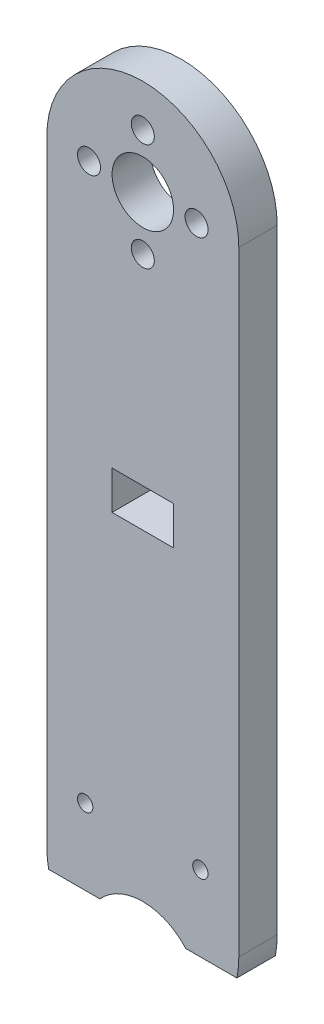
ISO-10303-21;
HEADER;
FILE_DESCRIPTION(('STEP AP214'),'2;1');
FILE_NAME('part.step','',(''),(''),'','','');
FILE_SCHEMA(('AUTOMOTIVE_DESIGN { 1 0 10303 214 1 1 1 1 }'));
ENDSEC;
DATA;
#1=APPLICATION_CONTEXT('core data for automotive mechanical design processes');
#2=APPLICATION_PROTOCOL_DEFINITION('international standard','automotive_design',2000,#1);
#3=PRODUCT_CONTEXT('',#1,'mechanical');
#4=PRODUCT('Part','Part','',(#3));
#5=PRODUCT_RELATED_PRODUCT_CATEGORY('part','',(#4));
#6=PRODUCT_DEFINITION_FORMATION('','',#4);
#7=PRODUCT_DEFINITION_CONTEXT('part definition',#1,'design');
#8=PRODUCT_DEFINITION('design','',#6,#7);
#9=PRODUCT_DEFINITION_SHAPE('','',#8);
#10=(LENGTH_UNIT() NAMED_UNIT(*) SI_UNIT(.MILLI.,.METRE.));
#11=(NAMED_UNIT(*) PLANE_ANGLE_UNIT() SI_UNIT($,.RADIAN.));
#12=(NAMED_UNIT(*) SI_UNIT($,.STERADIAN.) SOLID_ANGLE_UNIT());
#13=UNCERTAINTY_MEASURE_WITH_UNIT(LENGTH_MEASURE(1.E-05),#10,'distance_accuracy_value','');
#14=(GEOMETRIC_REPRESENTATION_CONTEXT(3) GLOBAL_UNCERTAINTY_ASSIGNED_CONTEXT((#13)) GLOBAL_UNIT_ASSIGNED_CONTEXT((#10,
#11,#12)) REPRESENTATION_CONTEXT('',''));
#15=CARTESIAN_POINT('',(0.,0.,0.));
#16=DIRECTION('',(0.,0.,1.));
#17=DIRECTION('',(1.,0.,0.));
#18=AXIS2_PLACEMENT_3D('',#15,#16,#17);
#19=CARTESIAN_POINT('',(0.,-47.5,5.));
#20=DIRECTION('',(0.,0.,-1.));
#21=DIRECTION('',(-1.,0.,0.));
#22=AXIS2_PLACEMENT_3D('',#19,#20,#21);
#23=CYLINDRICAL_SURFACE('',#22,7.5);
#24=CARTESIAN_POINT('',(0.,-47.5,0.));
#25=DIRECTION('',(0.,0.,1.));
#26=DIRECTION('',(1.,0.,0.));
#27=AXIS2_PLACEMENT_3D('',#24,#25,#26);
#28=CIRCLE('',#27,7.5);
#29=CARTESIAN_POINT('',(5.59016994374947,-42.5,0.));
#30=VERTEX_POINT('',#29);
#31=CARTESIAN_POINT('',(-5.59016994374947,-42.5,0.));
#32=VERTEX_POINT('',#31);
#33=EDGE_CURVE('E188',#30,#32,#28,.T.);
#34=ORIENTED_EDGE('',*,*,#33,.F.);
#35=DIRECTION('',(0.,0.,-1.));
#36=VECTOR('',#35,1.);
#37=CARTESIAN_POINT('',(5.59016994374947,-42.5,5.));
#38=LINE('',#37,#36);
#39=CARTESIAN_POINT('',(5.59016994374947,-42.5,5.));
#40=VERTEX_POINT('',#39);
#41=EDGE_CURVE('E126',#40,#30,#38,.T.);
#42=ORIENTED_EDGE('',*,*,#41,.F.);
#43=CARTESIAN_POINT('',(0.,-47.5,5.));
#44=DIRECTION('',(0.,0.,1.));
#45=DIRECTION('',(1.,0.,0.));
#46=AXIS2_PLACEMENT_3D('',#43,#44,#45);
#47=CIRCLE('',#46,7.5);
#48=CARTESIAN_POINT('',(-5.59016994374947,-42.5,5.));
#49=VERTEX_POINT('',#48);
#50=EDGE_CURVE('E227',#40,#49,#47,.T.);
#51=ORIENTED_EDGE('',*,*,#50,.T.);
#52=DIRECTION('',(0.,0.,-1.));
#53=VECTOR('',#52,1.);
#54=CARTESIAN_POINT('',(-5.59016994374947,-42.5,5.));
#55=LINE('',#54,#53);
#56=EDGE_CURVE('E161',#49,#32,#55,.T.);
#57=ORIENTED_EDGE('',*,*,#56,.T.);
#58=EDGE_LOOP('',(#34,#42,#51,#57));
#59=FACE_BOUND('',#58,.T.);
#60=ADVANCED_FACE('F35',(#59),#23,.F.);
#61=CARTESIAN_POINT('',(0.,-42.5,5.));
#62=DIRECTION('',(0.,1.,0.));
#63=DIRECTION('',(0.,0.,1.));
#64=AXIS2_PLACEMENT_3D('',#61,#62,#63);
#65=PLANE('',#64);
#66=DIRECTION('',(1.,0.,0.));
#67=VECTOR('',#66,1.);
#68=CARTESIAN_POINT('',(0.,-42.5,0.));
#69=LINE('',#68,#67);
#70=CARTESIAN_POINT('',(12.2474487139159,-42.5,0.));
#71=VERTEX_POINT('',#70);
#72=EDGE_CURVE('E185',#30,#71,#69,.T.);
#73=ORIENTED_EDGE('',*,*,#72,.T.);
#74=DIRECTION('',(0.,0.,-1.));
#75=VECTOR('',#74,1.);
#76=CARTESIAN_POINT('',(12.2474487139159,-42.5,5.));
#77=LINE('',#76,#75);
#78=CARTESIAN_POINT('',(12.2474487139159,-42.5,5.));
#79=VERTEX_POINT('',#78);
#80=EDGE_CURVE('E145',#79,#71,#77,.T.);
#81=ORIENTED_EDGE('',*,*,#80,.F.);
#82=DIRECTION('',(1.,0.,0.));
#83=VECTOR('',#82,1.);
#84=CARTESIAN_POINT('',(0.,-42.5,5.));
#85=LINE('',#84,#83);
#86=EDGE_CURVE('E224',#40,#79,#85,.T.);
#87=ORIENTED_EDGE('',*,*,#86,.F.);
#88=ORIENTED_EDGE('',*,*,#41,.T.);
#89=EDGE_LOOP('',(#73,#81,#87,#88));
#90=FACE_BOUND('',#89,.T.);
#91=ADVANCED_FACE('F272',(#90),#65,.F.);
#92=CARTESIAN_POINT('',(0.,-40.,5.));
#93=DIRECTION('',(0.,0.,-1.));
#94=DIRECTION('',(-1.,0.,0.));
#95=AXIS2_PLACEMENT_3D('',#92,#93,#94);
#96=CYLINDRICAL_SURFACE('',#95,12.5);
#97=CARTESIAN_POINT('',(0.,-40.,0.));
#98=DIRECTION('',(0.,0.,1.));
#99=DIRECTION('',(1.,0.,0.));
#100=AXIS2_PLACEMENT_3D('',#97,#98,#99);
#101=CIRCLE('',#100,12.5);
#102=CARTESIAN_POINT('',(12.5,-40.,0.));
#103=VERTEX_POINT('',#102);
#104=EDGE_CURVE('E182',#71,#103,#101,.T.);
#105=ORIENTED_EDGE('',*,*,#104,.T.);
#106=DIRECTION('',(0.,0.,-1.));
#107=VECTOR('',#106,1.);
#108=CARTESIAN_POINT('',(12.5,-40.,5.));
#109=LINE('',#108,#107);
#110=CARTESIAN_POINT('',(12.5,-40.,5.));
#111=VERTEX_POINT('',#110);
#112=EDGE_CURVE('E148',#111,#103,#109,.T.);
#113=ORIENTED_EDGE('',*,*,#112,.F.);
#114=CARTESIAN_POINT('',(0.,-40.,5.));
#115=DIRECTION('',(0.,0.,1.));
#116=DIRECTION('',(1.,0.,0.));
#117=AXIS2_PLACEMENT_3D('',#114,#115,#116);
#118=CIRCLE('',#117,12.5);
#119=EDGE_CURVE('E221',#79,#111,#118,.T.);
#120=ORIENTED_EDGE('',*,*,#119,.F.);
#121=ORIENTED_EDGE('',*,*,#80,.T.);
#122=EDGE_LOOP('',(#105,#113,#120,#121));
#123=FACE_BOUND('',#122,.T.);
#124=ADVANCED_FACE('F278',(#123),#96,.T.);
#125=CARTESIAN_POINT('',(12.5,0.,5.));
#126=DIRECTION('',(-1.,0.,0.));
#127=DIRECTION('',(0.,-1.,0.));
#128=AXIS2_PLACEMENT_3D('',#125,#126,#127);
#129=PLANE('',#128);
#130=DIRECTION('',(0.,1.,0.));
#131=VECTOR('',#130,1.);
#132=CARTESIAN_POINT('',(12.5,0.,0.));
#133=LINE('',#132,#131);
#134=CARTESIAN_POINT('',(12.5,40.,0.));
#135=VERTEX_POINT('',#134);
#136=EDGE_CURVE('E179',#103,#135,#133,.T.);
#137=ORIENTED_EDGE('',*,*,#136,.T.);
#138=DIRECTION('',(0.,0.,-1.));
#139=VECTOR('',#138,1.);
#140=CARTESIAN_POINT('',(12.5,40.,5.));
#141=LINE('',#140,#139);
#142=CARTESIAN_POINT('',(12.5,40.,5.));
#143=VERTEX_POINT('',#142);
#144=EDGE_CURVE('E151',#143,#135,#141,.T.);
#145=ORIENTED_EDGE('',*,*,#144,.F.);
#146=DIRECTION('',(0.,1.,0.));
#147=VECTOR('',#146,1.);
#148=CARTESIAN_POINT('',(12.5,0.,5.));
#149=LINE('',#148,#147);
#150=EDGE_CURVE('E218',#111,#143,#149,.T.);
#151=ORIENTED_EDGE('',*,*,#150,.F.);
#152=ORIENTED_EDGE('',*,*,#112,.T.);
#153=EDGE_LOOP('',(#137,#145,#151,#152));
#154=FACE_BOUND('',#153,.T.);
#155=ADVANCED_FACE('F285',(#154),#129,.F.);
#156=CARTESIAN_POINT('',(0.,40.,5.));
#157=DIRECTION('',(0.,0.,-1.));
#158=DIRECTION('',(-1.,0.,0.));
#159=AXIS2_PLACEMENT_3D('',#156,#157,#158);
#160=CYLINDRICAL_SURFACE('',#159,12.5);
#161=CARTESIAN_POINT('',(0.,40.,0.));
#162=DIRECTION('',(0.,0.,1.));
#163=DIRECTION('',(1.,0.,0.));
#164=AXIS2_PLACEMENT_3D('',#161,#162,#163);
#165=CIRCLE('',#164,12.5);
#166=CARTESIAN_POINT('',(-12.5,40.,0.));
#167=VERTEX_POINT('',#166);
#168=EDGE_CURVE('E176',#135,#167,#165,.T.);
#169=ORIENTED_EDGE('',*,*,#168,.T.);
#170=DIRECTION('',(0.,0.,-1.));
#171=VECTOR('',#170,1.);
#172=CARTESIAN_POINT('',(-12.5,40.,5.));
#173=LINE('',#172,#171);
#174=CARTESIAN_POINT('',(-12.5,40.,5.));
#175=VERTEX_POINT('',#174);
#176=EDGE_CURVE('E154',#175,#167,#173,.T.);
#177=ORIENTED_EDGE('',*,*,#176,.F.);
#178=CARTESIAN_POINT('',(0.,40.,5.));
#179=DIRECTION('',(0.,0.,1.));
#180=DIRECTION('',(1.,0.,0.));
#181=AXIS2_PLACEMENT_3D('',#178,#179,#180);
#182=CIRCLE('',#181,12.5);
#183=EDGE_CURVE('E216',#143,#175,#182,.T.);
#184=ORIENTED_EDGE('',*,*,#183,.F.);
#185=ORIENTED_EDGE('',*,*,#144,.T.);
#186=EDGE_LOOP('',(#169,#177,#184,#185));
#187=FACE_BOUND('',#186,.T.);
#188=ADVANCED_FACE('F346',(#187),#160,.T.);
#189=CARTESIAN_POINT('',(-12.5,0.,5.));
#190=DIRECTION('',(-1.,0.,0.));
#191=DIRECTION('',(0.,-1.,0.));
#192=AXIS2_PLACEMENT_3D('',#189,#190,#191);
#193=PLANE('',#192);
#194=DIRECTION('',(0.,1.,0.));
#195=VECTOR('',#194,1.);
#196=CARTESIAN_POINT('',(-12.5,0.,0.));
#197=LINE('',#196,#195);
#198=CARTESIAN_POINT('',(-12.5,-40.,0.));
#199=VERTEX_POINT('',#198);
#200=EDGE_CURVE('E172',#199,#167,#197,.T.);
#201=ORIENTED_EDGE('',*,*,#200,.F.);
#202=DIRECTION('',(0.,0.,-1.));
#203=VECTOR('',#202,1.);
#204=CARTESIAN_POINT('',(-12.5,-40.,5.));
#205=LINE('',#204,#203);
#206=CARTESIAN_POINT('',(-12.5,-40.,5.));
#207=VERTEX_POINT('',#206);
#208=EDGE_CURVE('E156',#207,#199,#205,.T.);
#209=ORIENTED_EDGE('',*,*,#208,.F.);
#210=DIRECTION('',(0.,1.,0.));
#211=VECTOR('',#210,1.);
#212=CARTESIAN_POINT('',(-12.5,0.,5.));
#213=LINE('',#212,#211);
#214=EDGE_CURVE('E212',#207,#175,#213,.T.);
#215=ORIENTED_EDGE('',*,*,#214,.T.);
#216=ORIENTED_EDGE('',*,*,#176,.T.);
#217=EDGE_LOOP('',(#201,#209,#215,#216));
#218=FACE_BOUND('',#217,.T.);
#219=ADVANCED_FACE('F343',(#218),#193,.T.);
#220=CARTESIAN_POINT('',(-12.2474487139159,-42.5,0.));
#221=VERTEX_POINT('',#220);
#222=EDGE_CURVE('E175',#199,#221,#101,.T.);
#223=ORIENTED_EDGE('',*,*,#222,.T.);
#224=DIRECTION('',(0.,0.,-1.));
#225=VECTOR('',#224,1.);
#226=CARTESIAN_POINT('',(-12.2474487139159,-42.5,5.));
#227=LINE('',#226,#225);
#228=CARTESIAN_POINT('',(-12.2474487139159,-42.5,5.));
#229=VERTEX_POINT('',#228);
#230=EDGE_CURVE('E158',#229,#221,#227,.T.);
#231=ORIENTED_EDGE('',*,*,#230,.F.);
#232=EDGE_CURVE('E215',#207,#229,#118,.T.);
#233=ORIENTED_EDGE('',*,*,#232,.F.);
#234=ORIENTED_EDGE('',*,*,#208,.T.);
#235=EDGE_LOOP('',(#223,#231,#233,#234));
#236=FACE_BOUND('',#235,.T.);
#237=ADVANCED_FACE('F336',(#236),#96,.T.);
#238=CARTESIAN_POINT('',(7.5,-32.65,5.));
#239=DIRECTION('',(0.,0.,-1.));
#240=DIRECTION('',(-1.,0.,0.));
#241=AXIS2_PLACEMENT_3D('',#238,#239,#240);
#242=CYLINDRICAL_SURFACE('',#241,1.);
#243=CARTESIAN_POINT('',(7.5,-32.65,5.));
#244=DIRECTION('',(0.,0.,1.));
#245=DIRECTION('',(1.,0.,0.));
#246=AXIS2_PLACEMENT_3D('',#243,#244,#245);
#247=CIRCLE('',#246,1.);
#248=CARTESIAN_POINT('',(8.5,-32.65,5.));
#249=VERTEX_POINT('',#248);
#250=EDGE_CURVE('E208',#249,#249,#247,.T.);
#251=ORIENTED_EDGE('',*,*,#250,.T.);
#252=EDGE_LOOP('',(#251));
#253=FACE_BOUND('',#252,.T.);
#254=CARTESIAN_POINT('',(7.5,-32.65,0.));
#255=DIRECTION('',(0.,0.,1.));
#256=DIRECTION('',(1.,0.,0.));
#257=AXIS2_PLACEMENT_3D('',#254,#255,#256);
#258=CIRCLE('',#257,1.);
#259=CARTESIAN_POINT('',(8.5,-32.65,0.));
#260=VERTEX_POINT('',#259);
#261=EDGE_CURVE('E168',#260,#260,#258,.T.);
#262=ORIENTED_EDGE('',*,*,#261,.F.);
#263=EDGE_LOOP('',(#262));
#264=FACE_BOUND('',#263,.T.);
#265=ADVANCED_FACE('F334',(#253,#264),#242,.F.);
#266=EDGE_CURVE('E171',#221,#32,#69,.T.);
#267=ORIENTED_EDGE('',*,*,#266,.T.);
#268=ORIENTED_EDGE('',*,*,#56,.F.);
#269=EDGE_CURVE('E211',#229,#49,#85,.T.);
#270=ORIENTED_EDGE('',*,*,#269,.F.);
#271=ORIENTED_EDGE('',*,*,#230,.T.);
#272=EDGE_LOOP('',(#267,#268,#270,#271));
#273=FACE_BOUND('',#272,.T.);
#274=ADVANCED_FACE('F281',(#273),#65,.F.);
#275=CARTESIAN_POINT('',(0.,33.,5.));
#276=DIRECTION('',(0.,0.,-1.));
#277=DIRECTION('',(-1.,0.,0.));
#278=AXIS2_PLACEMENT_3D('',#275,#276,#277);
#279=CYLINDRICAL_SURFACE('',#278,1.5);
#280=CARTESIAN_POINT('',(0.,33.,5.));
#281=DIRECTION('',(0.,0.,1.));
#282=DIRECTION('',(1.,0.,0.));
#283=AXIS2_PLACEMENT_3D('',#280,#281,#282);
#284=CIRCLE('',#283,1.5);
#285=CARTESIAN_POINT('',(1.5,33.,5.));
#286=VERTEX_POINT('',#285);
#287=EDGE_CURVE('E230',#286,#286,#284,.F.);
#288=ORIENTED_EDGE('',*,*,#287,.F.);
#289=EDGE_LOOP('',(#288));
#290=FACE_BOUND('',#289,.T.);
#291=CARTESIAN_POINT('',(0.,33.,0.));
#292=DIRECTION('',(0.,0.,1.));
#293=DIRECTION('',(1.,0.,0.));
#294=AXIS2_PLACEMENT_3D('',#291,#292,#293);
#295=CIRCLE('',#294,1.5);
#296=CARTESIAN_POINT('',(1.5,33.,0.));
#297=VERTEX_POINT('',#296);
#298=EDGE_CURVE('E191',#297,#297,#295,.F.);
#299=ORIENTED_EDGE('',*,*,#298,.T.);
#300=EDGE_LOOP('',(#299));
#301=FACE_BOUND('',#300,.T.);
#302=ADVANCED_FACE('F287',(#290,#301),#279,.F.);
#303=CARTESIAN_POINT('',(7.,40.,5.));
#304=DIRECTION('',(0.,0.,-1.));
#305=DIRECTION('',(-1.,0.,0.));
#306=AXIS2_PLACEMENT_3D('',#303,#304,#305);
#307=CYLINDRICAL_SURFACE('',#306,1.5);
#308=CARTESIAN_POINT('',(7.,40.,5.));
#309=DIRECTION('',(0.,0.,1.));
#310=DIRECTION('',(1.,0.,0.));
#311=AXIS2_PLACEMENT_3D('',#308,#309,#310);
#312=CIRCLE('',#311,1.5);
#313=CARTESIAN_POINT('',(8.5,40.,5.));
#314=VERTEX_POINT('',#313);
#315=EDGE_CURVE('E233',#314,#314,#312,.T.);
#316=ORIENTED_EDGE('',*,*,#315,.T.);
#317=EDGE_LOOP('',(#316));
#318=FACE_BOUND('',#317,.T.);
#319=CARTESIAN_POINT('',(7.,40.,0.));
#320=DIRECTION('',(0.,0.,1.));
#321=DIRECTION('',(1.,0.,0.));
#322=AXIS2_PLACEMENT_3D('',#319,#320,#321);
#323=CIRCLE('',#322,1.5);
#324=CARTESIAN_POINT('',(8.5,40.,0.));
#325=VERTEX_POINT('',#324);
#326=EDGE_CURVE('E194',#325,#325,#323,.T.);
#327=ORIENTED_EDGE('',*,*,#326,.F.);
#328=EDGE_LOOP('',(#327));
#329=FACE_BOUND('',#328,.T.);
#330=ADVANCED_FACE('F290',(#318,#329),#307,.F.);
#331=CARTESIAN_POINT('',(0.,47.,5.));
#332=DIRECTION('',(0.,0.,-1.));
#333=DIRECTION('',(-1.,0.,0.));
#334=AXIS2_PLACEMENT_3D('',#331,#332,#333);
#335=CYLINDRICAL_SURFACE('',#334,1.5);
#336=CARTESIAN_POINT('',(0.,47.,5.));
#337=DIRECTION('',(0.,0.,1.));
#338=DIRECTION('',(1.,0.,0.));
#339=AXIS2_PLACEMENT_3D('',#336,#337,#338);
#340=CIRCLE('',#339,1.5);
#341=CARTESIAN_POINT('',(1.5,47.,5.));
#342=VERTEX_POINT('',#341);
#343=EDGE_CURVE('E236',#342,#342,#340,.T.);
#344=ORIENTED_EDGE('',*,*,#343,.T.);
#345=EDGE_LOOP('',(#344));
#346=FACE_BOUND('',#345,.T.);
#347=CARTESIAN_POINT('',(0.,47.,0.));
#348=DIRECTION('',(0.,0.,1.));
#349=DIRECTION('',(1.,0.,0.));
#350=AXIS2_PLACEMENT_3D('',#347,#348,#349);
#351=CIRCLE('',#350,1.5);
#352=CARTESIAN_POINT('',(1.5,47.,0.));
#353=VERTEX_POINT('',#352);
#354=EDGE_CURVE('E197',#353,#353,#351,.T.);
#355=ORIENTED_EDGE('',*,*,#354,.F.);
#356=EDGE_LOOP('',(#355));
#357=FACE_BOUND('',#356,.T.);
#358=ADVANCED_FACE('F294',(#346,#357),#335,.F.);
#359=CARTESIAN_POINT('',(0.,40.,5.));
#360=DIRECTION('',(0.,0.,-1.));
#361=DIRECTION('',(-1.,0.,0.));
#362=AXIS2_PLACEMENT_3D('',#359,#360,#361);
#363=CYLINDRICAL_SURFACE('',#362,4.);
#364=CARTESIAN_POINT('',(0.,40.,5.));
#365=DIRECTION('',(0.,0.,1.));
#366=DIRECTION('',(1.,0.,0.));
#367=AXIS2_PLACEMENT_3D('',#364,#365,#366);
#368=CIRCLE('',#367,4.);
#369=CARTESIAN_POINT('',(3.99999999999999,40.,5.));
#370=VERTEX_POINT('',#369);
#371=EDGE_CURVE('E239',#370,#370,#368,.T.);
#372=ORIENTED_EDGE('',*,*,#371,.T.);
#373=EDGE_LOOP('',(#372));
#374=FACE_BOUND('',#373,.T.);
#375=CARTESIAN_POINT('',(0.,40.,0.));
#376=DIRECTION('',(0.,0.,1.));
#377=DIRECTION('',(1.,0.,0.));
#378=AXIS2_PLACEMENT_3D('',#375,#376,#377);
#379=CIRCLE('',#378,4.);
#380=CARTESIAN_POINT('',(3.99999999999999,40.,0.));
#381=VERTEX_POINT('',#380);
#382=EDGE_CURVE('E200',#381,#381,#379,.T.);
#383=ORIENTED_EDGE('',*,*,#382,.F.);
#384=EDGE_LOOP('',(#383));
#385=FACE_BOUND('',#384,.T.);
#386=ADVANCED_FACE('F297',(#374,#385),#363,.F.);
#387=CARTESIAN_POINT('',(-7.00000000000001,40.,5.));
#388=DIRECTION('',(0.,0.,-1.));
#389=DIRECTION('',(-1.,0.,0.));
#390=AXIS2_PLACEMENT_3D('',#387,#388,#389);
#391=CYLINDRICAL_SURFACE('',#390,1.5);
#392=CARTESIAN_POINT('',(-7.00000000000001,40.,5.));
#393=DIRECTION('',(0.,0.,1.));
#394=DIRECTION('',(1.,0.,0.));
#395=AXIS2_PLACEMENT_3D('',#392,#393,#394);
#396=CIRCLE('',#395,1.5);
#397=CARTESIAN_POINT('',(-5.50000000000001,40.,5.));
#398=VERTEX_POINT('',#397);
#399=EDGE_CURVE('E167',#398,#398,#396,.F.);
#400=ORIENTED_EDGE('',*,*,#399,.F.);
#401=EDGE_LOOP('',(#400));
#402=FACE_BOUND('',#401,.T.);
#403=CARTESIAN_POINT('',(-7.00000000000001,40.,0.));
#404=DIRECTION('',(0.,0.,1.));
#405=DIRECTION('',(1.,0.,0.));
#406=AXIS2_PLACEMENT_3D('',#403,#404,#405);
#407=CIRCLE('',#406,1.5);
#408=CARTESIAN_POINT('',(-5.50000000000001,40.,0.));
#409=VERTEX_POINT('',#408);
#410=EDGE_CURVE('E203',#409,#409,#407,.F.);
#411=ORIENTED_EDGE('',*,*,#410,.T.);
#412=EDGE_LOOP('',(#411));
#413=FACE_BOUND('',#412,.T.);
#414=ADVANCED_FACE('F37',(#402,#413),#391,.F.);
#415=CARTESIAN_POINT('',(-7.5,-32.65,5.));
#416=DIRECTION('',(0.,0.,-1.));
#417=DIRECTION('',(-1.,0.,0.));
#418=AXIS2_PLACEMENT_3D('',#415,#416,#417);
#419=CYLINDRICAL_SURFACE('',#418,1.);
#420=CARTESIAN_POINT('',(-7.5,-32.65,5.));
#421=DIRECTION('',(0.,0.,1.));
#422=DIRECTION('',(1.,0.,0.));
#423=AXIS2_PLACEMENT_3D('',#420,#421,#422);
#424=CIRCLE('',#423,1.);
#425=CARTESIAN_POINT('',(-6.5,-32.65,5.));
#426=VERTEX_POINT('',#425);
#427=EDGE_CURVE('E163',#426,#426,#424,.F.);
#428=ORIENTED_EDGE('',*,*,#427,.F.);
#429=EDGE_LOOP('',(#428));
#430=FACE_BOUND('',#429,.T.);
#431=CARTESIAN_POINT('',(-7.5,-32.65,0.));
#432=DIRECTION('',(0.,0.,1.));
#433=DIRECTION('',(1.,0.,0.));
#434=AXIS2_PLACEMENT_3D('',#431,#432,#433);
#435=CIRCLE('',#434,1.);
#436=CARTESIAN_POINT('',(-6.5,-32.65,0.));
#437=VERTEX_POINT('',#436);
#438=EDGE_CURVE('E164',#437,#437,#435,.F.);
#439=ORIENTED_EDGE('',*,*,#438,.T.);
#440=EDGE_LOOP('',(#439));
#441=FACE_BOUND('',#440,.T.);
#442=ADVANCED_FACE('F304',(#430,#441),#419,.F.);
#443=CARTESIAN_POINT('',(0.,0.,5.));
#444=DIRECTION('',(0.,0.,1.));
#445=DIRECTION('',(1.,0.,0.));
#446=AXIS2_PLACEMENT_3D('',#443,#444,#445);
#447=PLANE('',#446);
#448=DIRECTION('',(0.,1.,0.));
#449=VECTOR('',#448,1.);
#450=CARTESIAN_POINT('',(4.,0.,5.));
#451=LINE('',#450,#449);
#452=CARTESIAN_POINT('',(4.,1.87999999999999,5.));
#453=VERTEX_POINT('',#452);
#454=CARTESIAN_POINT('',(4.,6.87999999999999,5.));
#455=VERTEX_POINT('',#454);
#456=EDGE_CURVE('E133',#453,#455,#451,.T.);
#457=ORIENTED_EDGE('',*,*,#456,.F.);
#458=DIRECTION('',(1.,0.,0.));
#459=VECTOR('',#458,1.);
#460=CARTESIAN_POINT('',(0.,1.87999999999999,5.));
#461=LINE('',#460,#459);
#462=CARTESIAN_POINT('',(-4.,1.87999999999999,5.));
#463=VERTEX_POINT('',#462);
#464=EDGE_CURVE('E245',#463,#453,#461,.T.);
#465=ORIENTED_EDGE('',*,*,#464,.F.);
#466=DIRECTION('',(0.,-1.,0.));
#467=VECTOR('',#466,1.);
#468=CARTESIAN_POINT('',(-4.,0.,5.));
#469=LINE('',#468,#467);
#470=CARTESIAN_POINT('',(-4.,6.87999999999999,5.));
#471=VERTEX_POINT('',#470);
#472=EDGE_CURVE('E247',#471,#463,#469,.T.);
#473=ORIENTED_EDGE('',*,*,#472,.F.);
#474=DIRECTION('',(-1.,0.,0.));
#475=VECTOR('',#474,1.);
#476=CARTESIAN_POINT('',(0.,6.87999999999999,5.));
#477=LINE('',#476,#475);
#478=EDGE_CURVE('E249',#455,#471,#477,.T.);
#479=ORIENTED_EDGE('',*,*,#478,.F.);
#480=EDGE_LOOP('',(#457,#465,#473,#479));
#481=FACE_BOUND('',#480,.T.);
#482=ORIENTED_EDGE('',*,*,#399,.T.);
#483=EDGE_LOOP('',(#482));
#484=FACE_BOUND('',#483,.T.);
#485=ORIENTED_EDGE('',*,*,#371,.F.);
#486=EDGE_LOOP('',(#485));
#487=FACE_BOUND('',#486,.T.);
#488=ORIENTED_EDGE('',*,*,#343,.F.);
#489=EDGE_LOOP('',(#488));
#490=FACE_BOUND('',#489,.T.);
#491=ORIENTED_EDGE('',*,*,#315,.F.);
#492=EDGE_LOOP('',(#491));
#493=FACE_BOUND('',#492,.T.);
#494=ORIENTED_EDGE('',*,*,#287,.T.);
#495=EDGE_LOOP('',(#494));
#496=FACE_BOUND('',#495,.T.);
#497=ORIENTED_EDGE('',*,*,#50,.F.);
#498=ORIENTED_EDGE('',*,*,#86,.T.);
#499=ORIENTED_EDGE('',*,*,#119,.T.);
#500=ORIENTED_EDGE('',*,*,#150,.T.);
#501=ORIENTED_EDGE('',*,*,#183,.T.);
#502=ORIENTED_EDGE('',*,*,#214,.F.);
#503=ORIENTED_EDGE('',*,*,#232,.T.);
#504=ORIENTED_EDGE('',*,*,#269,.T.);
#505=EDGE_LOOP('',(#497,#498,#499,#500,#501,#502,#503,#504));
#506=FACE_BOUND('',#505,.T.);
#507=ORIENTED_EDGE('',*,*,#250,.F.);
#508=EDGE_LOOP('',(#507));
#509=FACE_BOUND('',#508,.T.);
#510=ORIENTED_EDGE('',*,*,#427,.T.);
#511=EDGE_LOOP('',(#510));
#512=FACE_BOUND('',#511,.T.);
#513=ADVANCED_FACE('F257',(#481,#484,#487,#490,#493,#496,#506,#509,#512),#447,.T.);
#514=CARTESIAN_POINT('',(0.,0.,0.));
#515=DIRECTION('',(0.,0.,1.));
#516=DIRECTION('',(1.,0.,0.));
#517=AXIS2_PLACEMENT_3D('',#514,#515,#516);
#518=PLANE('',#517);
#519=DIRECTION('',(1.,0.,0.));
#520=VECTOR('',#519,1.);
#521=CARTESIAN_POINT('',(0.,1.87999999999999,0.));
#522=LINE('',#521,#520);
#523=CARTESIAN_POINT('',(-4.,1.87999999999999,0.));
#524=VERTEX_POINT('',#523);
#525=CARTESIAN_POINT('',(4.,1.87999999999999,0.));
#526=VERTEX_POINT('',#525);
#527=EDGE_CURVE('E43',#524,#526,#522,.T.);
#528=ORIENTED_EDGE('',*,*,#527,.T.);
#529=DIRECTION('',(0.,1.,0.));
#530=VECTOR('',#529,1.);
#531=CARTESIAN_POINT('',(4.,0.,0.));
#532=LINE('',#531,#530);
#533=CARTESIAN_POINT('',(4.,6.87999999999999,0.));
#534=VERTEX_POINT('',#533);
#535=EDGE_CURVE('E11',#526,#534,#532,.T.);
#536=ORIENTED_EDGE('',*,*,#535,.T.);
#537=DIRECTION('',(-1.,0.,0.));
#538=VECTOR('',#537,1.);
#539=CARTESIAN_POINT('',(0.,6.87999999999999,0.));
#540=LINE('',#539,#538);
#541=CARTESIAN_POINT('',(-4.,6.87999999999999,0.));
#542=VERTEX_POINT('',#541);
#543=EDGE_CURVE('E121',#534,#542,#540,.T.);
#544=ORIENTED_EDGE('',*,*,#543,.T.);
#545=DIRECTION('',(0.,-1.,0.));
#546=VECTOR('',#545,1.);
#547=CARTESIAN_POINT('',(-4.,0.,0.));
#548=LINE('',#547,#546);
#549=EDGE_CURVE('E125',#542,#524,#548,.T.);
#550=ORIENTED_EDGE('',*,*,#549,.T.);
#551=EDGE_LOOP('',(#528,#536,#544,#550));
#552=FACE_BOUND('',#551,.T.);
#553=ORIENTED_EDGE('',*,*,#410,.F.);
#554=EDGE_LOOP('',(#553));
#555=FACE_BOUND('',#554,.T.);
#556=ORIENTED_EDGE('',*,*,#382,.T.);
#557=EDGE_LOOP('',(#556));
#558=FACE_BOUND('',#557,.T.);
#559=ORIENTED_EDGE('',*,*,#354,.T.);
#560=EDGE_LOOP('',(#559));
#561=FACE_BOUND('',#560,.T.);
#562=ORIENTED_EDGE('',*,*,#326,.T.);
#563=EDGE_LOOP('',(#562));
#564=FACE_BOUND('',#563,.T.);
#565=ORIENTED_EDGE('',*,*,#298,.F.);
#566=EDGE_LOOP('',(#565));
#567=FACE_BOUND('',#566,.T.);
#568=ORIENTED_EDGE('',*,*,#33,.T.);
#569=ORIENTED_EDGE('',*,*,#266,.F.);
#570=ORIENTED_EDGE('',*,*,#222,.F.);
#571=ORIENTED_EDGE('',*,*,#200,.T.);
#572=ORIENTED_EDGE('',*,*,#168,.F.);
#573=ORIENTED_EDGE('',*,*,#136,.F.);
#574=ORIENTED_EDGE('',*,*,#104,.F.);
#575=ORIENTED_EDGE('',*,*,#72,.F.);
#576=EDGE_LOOP('',(#568,#569,#570,#571,#572,#573,#574,#575));
#577=FACE_BOUND('',#576,.T.);
#578=ORIENTED_EDGE('',*,*,#261,.T.);
#579=EDGE_LOOP('',(#578));
#580=FACE_BOUND('',#579,.T.);
#581=ORIENTED_EDGE('',*,*,#438,.F.);
#582=EDGE_LOOP('',(#581));
#583=FACE_BOUND('',#582,.T.);
#584=ADVANCED_FACE('F137',(#552,#555,#558,#561,#564,#567,#577,#580,#583),#518,.F.);
#585=CARTESIAN_POINT('',(4.,6.87999999999999,-4.));
#586=DIRECTION('',(1.,0.,0.));
#587=DIRECTION('',(0.,1.,0.));
#588=AXIS2_PLACEMENT_3D('',#585,#586,#587);
#589=PLANE('',#588);
#590=ORIENTED_EDGE('',*,*,#456,.T.);
#591=DIRECTION('',(0.,0.,1.));
#592=VECTOR('',#591,1.);
#593=CARTESIAN_POINT('',(4.,6.87999999999999,-4.));
#594=LINE('',#593,#592);
#595=EDGE_CURVE('E50',#534,#455,#594,.T.);
#596=ORIENTED_EDGE('',*,*,#595,.F.);
#597=ORIENTED_EDGE('',*,*,#535,.F.);
#598=DIRECTION('',(0.,0.,1.));
#599=VECTOR('',#598,1.);
#600=CARTESIAN_POINT('',(4.,1.87999999999999,-4.));
#601=LINE('',#600,#599);
#602=EDGE_CURVE('E250',#526,#453,#601,.T.);
#603=ORIENTED_EDGE('',*,*,#602,.T.);
#604=EDGE_LOOP('',(#590,#596,#597,#603));
#605=FACE_BOUND('',#604,.T.);
#606=ADVANCED_FACE('F129',(#605),#589,.F.);
#607=CARTESIAN_POINT('',(-4.,1.87999999999999,-4.));
#608=DIRECTION('',(0.,-1.,0.));
#609=DIRECTION('',(0.,0.,-1.));
#610=AXIS2_PLACEMENT_3D('',#607,#608,#609);
#611=PLANE('',#610);
#612=ORIENTED_EDGE('',*,*,#464,.T.);
#613=ORIENTED_EDGE('',*,*,#602,.F.);
#614=ORIENTED_EDGE('',*,*,#527,.F.);
#615=DIRECTION('',(0.,0.,1.));
#616=VECTOR('',#615,1.);
#617=CARTESIAN_POINT('',(-4.,1.87999999999999,-4.));
#618=LINE('',#617,#616);
#619=EDGE_CURVE('E253',#524,#463,#618,.T.);
#620=ORIENTED_EDGE('',*,*,#619,.T.);
#621=EDGE_LOOP('',(#612,#613,#614,#620));
#622=FACE_BOUND('',#621,.T.);
#623=ADVANCED_FACE('F262',(#622),#611,.F.);
#624=CARTESIAN_POINT('',(-4.,6.87999999999999,-4.));
#625=DIRECTION('',(-1.,0.,0.));
#626=DIRECTION('',(0.,-1.,0.));
#627=AXIS2_PLACEMENT_3D('',#624,#625,#626);
#628=PLANE('',#627);
#629=ORIENTED_EDGE('',*,*,#472,.T.);
#630=ORIENTED_EDGE('',*,*,#619,.F.);
#631=ORIENTED_EDGE('',*,*,#549,.F.);
#632=DIRECTION('',(0.,0.,1.));
#633=VECTOR('',#632,1.);
#634=CARTESIAN_POINT('',(-4.,6.87999999999999,-4.));
#635=LINE('',#634,#633);
#636=EDGE_CURVE('E55',#542,#471,#635,.T.);
#637=ORIENTED_EDGE('',*,*,#636,.T.);
#638=EDGE_LOOP('',(#629,#630,#631,#637));
#639=FACE_BOUND('',#638,.T.);
#640=ADVANCED_FACE('F261',(#639),#628,.F.);
#641=CARTESIAN_POINT('',(-4.,6.87999999999999,-4.));
#642=DIRECTION('',(0.,1.,0.));
#643=DIRECTION('',(0.,0.,1.));
#644=AXIS2_PLACEMENT_3D('',#641,#642,#643);
#645=PLANE('',#644);
#646=ORIENTED_EDGE('',*,*,#478,.T.);
#647=ORIENTED_EDGE('',*,*,#636,.F.);
#648=ORIENTED_EDGE('',*,*,#543,.F.);
#649=ORIENTED_EDGE('',*,*,#595,.T.);
#650=EDGE_LOOP('',(#646,#647,#648,#649));
#651=FACE_BOUND('',#650,.T.);
#652=ADVANCED_FACE('F122',(#651),#645,.F.);
#653=CLOSED_SHELL('',(#60,#91,#124,#155,#188,#219,#237,#265,#274,#302,#330,#358,#386,#414,#442,
#513,#584,#606,#623,#640,#652));
#654=MANIFOLD_SOLID_BREP('B2',#653);
#655=ADVANCED_BREP_SHAPE_REPRESENTATION('',(#18,#654),#14);
#656=SHAPE_DEFINITION_REPRESENTATION(#9,#655);
ENDSEC;
END-ISO-10303-21;
